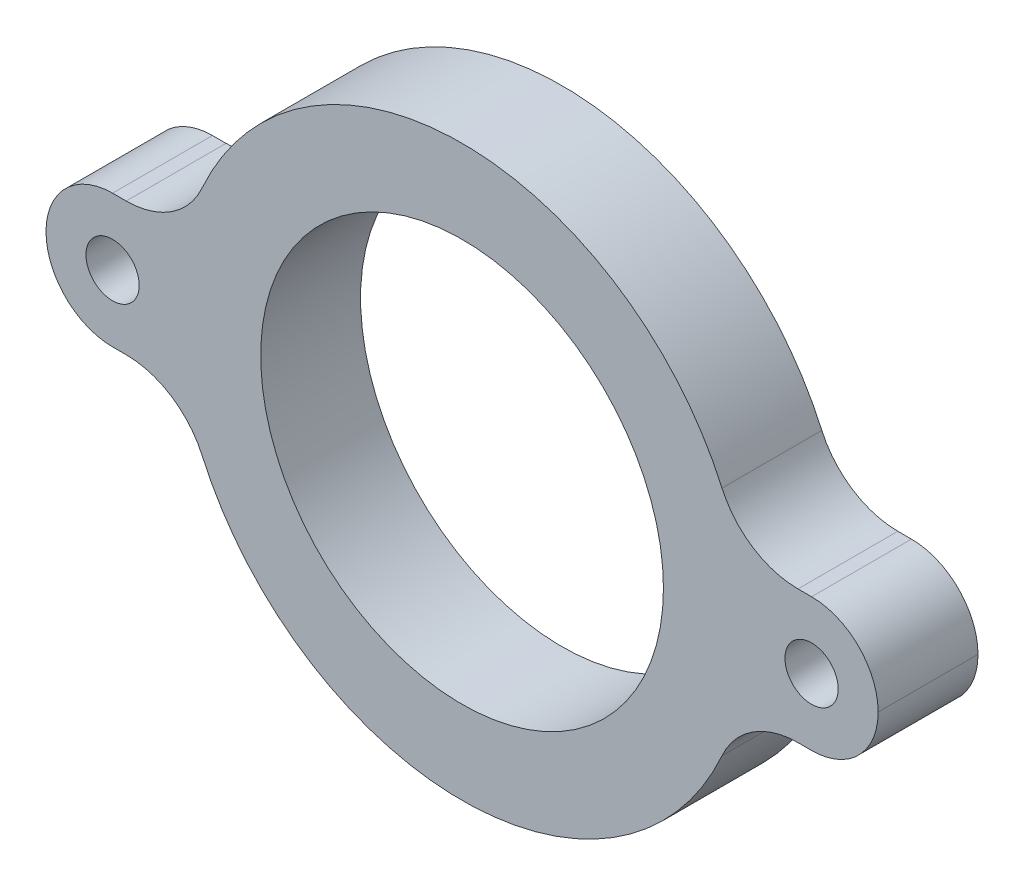
ISO-10303-21;
HEADER;
FILE_DESCRIPTION(('STEP AP214'),'2;1');
FILE_NAME('part.step','',(''),(''),'','','');
FILE_SCHEMA(('AUTOMOTIVE_DESIGN { 1 0 10303 214 1 1 1 1 }'));
ENDSEC;
DATA;
#1=APPLICATION_CONTEXT('core data for automotive mechanical design processes');
#2=APPLICATION_PROTOCOL_DEFINITION('international standard','automotive_design',2000,#1);
#3=PRODUCT_CONTEXT('',#1,'mechanical');
#4=PRODUCT('Part','Part','',(#3));
#5=PRODUCT_RELATED_PRODUCT_CATEGORY('part','',(#4));
#6=PRODUCT_DEFINITION_FORMATION('','',#4);
#7=PRODUCT_DEFINITION_CONTEXT('part definition',#1,'design');
#8=PRODUCT_DEFINITION('design','',#6,#7);
#9=PRODUCT_DEFINITION_SHAPE('','',#8);
#10=(LENGTH_UNIT() NAMED_UNIT(*) SI_UNIT(.MILLI.,.METRE.));
#11=(NAMED_UNIT(*) PLANE_ANGLE_UNIT() SI_UNIT($,.RADIAN.));
#12=(NAMED_UNIT(*) SI_UNIT($,.STERADIAN.) SOLID_ANGLE_UNIT());
#13=UNCERTAINTY_MEASURE_WITH_UNIT(LENGTH_MEASURE(1.E-05),#10,'distance_accuracy_value','');
#14=(GEOMETRIC_REPRESENTATION_CONTEXT(3) GLOBAL_UNCERTAINTY_ASSIGNED_CONTEXT((#13)) GLOBAL_UNIT_ASSIGNED_CONTEXT((#10,
#11,#12)) REPRESENTATION_CONTEXT('',''));
#15=CARTESIAN_POINT('',(0.,0.,0.));
#16=DIRECTION('',(0.,0.,1.));
#17=DIRECTION('',(1.,0.,0.));
#18=AXIS2_PLACEMENT_3D('',#15,#16,#17);
#19=CARTESIAN_POINT('',(0.,0.,6.));
#20=DIRECTION('',(0.,0.,-1.));
#21=DIRECTION('',(-1.,0.,0.));
#22=AXIS2_PLACEMENT_3D('',#19,#20,#21);
#23=PLANE('',#22);
#24=DIRECTION('',(1.,0.,0.));
#25=VECTOR('',#24,1.);
#26=CARTESIAN_POINT('',(25.,-4.,6.));
#27=LINE('',#26,#25);
#28=CARTESIAN_POINT('',(20.1843999167674,-4.,6.));
#29=VERTEX_POINT('',#28);
#30=CARTESIAN_POINT('',(21.,-4.,6.));
#31=VERTEX_POINT('',#30);
#32=EDGE_CURVE('E252',#29,#31,#27,.T.);
#33=ORIENTED_EDGE('',*,*,#32,.T.);
#34=CARTESIAN_POINT('',(21.,0.,6.));
#35=DIRECTION('',(0.,0.,-1.));
#36=DIRECTION('',(-1.,0.,0.));
#37=AXIS2_PLACEMENT_3D('',#34,#35,#36);
#38=CIRCLE('',#37,4.);
#39=CARTESIAN_POINT('',(25.,0.,6.));
#40=VERTEX_POINT('',#39);
#41=EDGE_CURVE('E218',#31,#40,#38,.F.);
#42=ORIENTED_EDGE('',*,*,#41,.T.);
#43=CARTESIAN_POINT('',(21.,0.,6.));
#44=DIRECTION('',(0.,0.,-1.));
#45=DIRECTION('',(-1.,0.,0.));
#46=AXIS2_PLACEMENT_3D('',#43,#44,#45);
#47=CIRCLE('',#46,4.);
#48=CARTESIAN_POINT('',(21.,4.,6.));
#49=VERTEX_POINT('',#48);
#50=EDGE_CURVE('E56',#40,#49,#47,.F.);
#51=ORIENTED_EDGE('',*,*,#50,.T.);
#52=DIRECTION('',(-1.,0.,0.));
#53=VECTOR('',#52,1.);
#54=CARTESIAN_POINT('',(25.,4.,6.));
#55=LINE('',#54,#53);
#56=CARTESIAN_POINT('',(20.1843999167674,4.,6.));
#57=VERTEX_POINT('',#56);
#58=EDGE_CURVE('E249',#49,#57,#55,.T.);
#59=ORIENTED_EDGE('',*,*,#58,.T.);
#60=CARTESIAN_POINT('',(20.1843999167674,9.,6.));
#61=DIRECTION('',(0.,0.,-1.));
#62=DIRECTION('',(-1.,0.,0.));
#63=AXIS2_PLACEMENT_3D('',#60,#61,#62);
#64=CIRCLE('',#63,5.);
#65=CARTESIAN_POINT('',(15.6177936007567,6.96380090497737,6.));
#66=VERTEX_POINT('',#65);
#67=EDGE_CURVE('E147',#57,#66,#64,.T.);
#68=ORIENTED_EDGE('',*,*,#67,.T.);
#69=CARTESIAN_POINT('',(0.,0.,6.));
#70=DIRECTION('',(0.,0.,1.));
#71=DIRECTION('',(-1.,0.,0.));
#72=AXIS2_PLACEMENT_3D('',#69,#70,#71);
#73=CIRCLE('',#72,17.1);
#74=CARTESIAN_POINT('',(-15.6177936007567,6.96380090497737,6.));
#75=VERTEX_POINT('',#74);
#76=EDGE_CURVE('E157',#66,#75,#73,.T.);
#77=ORIENTED_EDGE('',*,*,#76,.T.);
#78=CARTESIAN_POINT('',(-20.1843999167674,9.,6.));
#79=DIRECTION('',(0.,0.,-1.));
#80=DIRECTION('',(-1.,0.,0.));
#81=AXIS2_PLACEMENT_3D('',#78,#79,#80);
#82=CIRCLE('',#81,5.);
#83=CARTESIAN_POINT('',(-20.1843999167674,4.,6.));
#84=VERTEX_POINT('',#83);
#85=EDGE_CURVE('E200',#75,#84,#82,.T.);
#86=ORIENTED_EDGE('',*,*,#85,.T.);
#87=DIRECTION('',(-1.,0.,0.));
#88=VECTOR('',#87,1.);
#89=CARTESIAN_POINT('',(-25.,4.,6.));
#90=LINE('',#89,#88);
#91=CARTESIAN_POINT('',(-21.,4.,6.));
#92=VERTEX_POINT('',#91);
#93=EDGE_CURVE('E173',#84,#92,#90,.T.);
#94=ORIENTED_EDGE('',*,*,#93,.T.);
#95=CARTESIAN_POINT('',(-21.,0.,6.));
#96=DIRECTION('',(0.,0.,-1.));
#97=DIRECTION('',(-1.,0.,0.));
#98=AXIS2_PLACEMENT_3D('',#95,#96,#97);
#99=CIRCLE('',#98,4.);
#100=CARTESIAN_POINT('',(-25.,0.,6.));
#101=VERTEX_POINT('',#100);
#102=EDGE_CURVE('E213',#92,#101,#99,.F.);
#103=ORIENTED_EDGE('',*,*,#102,.T.);
#104=CARTESIAN_POINT('',(-21.,0.,6.));
#105=DIRECTION('',(0.,0.,-1.));
#106=DIRECTION('',(-1.,0.,0.));
#107=AXIS2_PLACEMENT_3D('',#104,#105,#106);
#108=CIRCLE('',#107,4.);
#109=CARTESIAN_POINT('',(-21.,-4.,6.));
#110=VERTEX_POINT('',#109);
#111=EDGE_CURVE('E215',#101,#110,#108,.F.);
#112=ORIENTED_EDGE('',*,*,#111,.T.);
#113=DIRECTION('',(1.,0.,0.));
#114=VECTOR('',#113,1.);
#115=CARTESIAN_POINT('',(-25.,-4.,6.));
#116=LINE('',#115,#114);
#117=CARTESIAN_POINT('',(-20.1843999167674,-4.,6.));
#118=VERTEX_POINT('',#117);
#119=EDGE_CURVE('E167',#110,#118,#116,.T.);
#120=ORIENTED_EDGE('',*,*,#119,.T.);
#121=CARTESIAN_POINT('',(-20.1843999167674,-9.,6.));
#122=DIRECTION('',(0.,0.,-1.));
#123=DIRECTION('',(-1.,0.,0.));
#124=AXIS2_PLACEMENT_3D('',#121,#122,#123);
#125=CIRCLE('',#124,5.);
#126=CARTESIAN_POINT('',(-15.6177936007567,-6.96380090497737,6.));
#127=VERTEX_POINT('',#126);
#128=EDGE_CURVE('E197',#118,#127,#125,.T.);
#129=ORIENTED_EDGE('',*,*,#128,.T.);
#130=CARTESIAN_POINT('',(0.,0.,6.));
#131=DIRECTION('',(0.,0.,1.));
#132=DIRECTION('',(1.,0.,0.));
#133=AXIS2_PLACEMENT_3D('',#130,#131,#132);
#134=CIRCLE('',#133,17.1);
#135=CARTESIAN_POINT('',(15.6177936007567,-6.96380090497737,6.));
#136=VERTEX_POINT('',#135);
#137=EDGE_CURVE('E322',#127,#136,#134,.T.);
#138=ORIENTED_EDGE('',*,*,#137,.T.);
#139=CARTESIAN_POINT('',(20.1843999167674,-9.,6.));
#140=DIRECTION('',(0.,0.,-1.));
#141=DIRECTION('',(-1.,0.,0.));
#142=AXIS2_PLACEMENT_3D('',#139,#140,#141);
#143=CIRCLE('',#142,5.);
#144=EDGE_CURVE('E192',#136,#29,#143,.T.);
#145=ORIENTED_EDGE('',*,*,#144,.T.);
#146=EDGE_LOOP('',(#33,#42,#51,#59,#68,#77,#86,#94,#103,#112,#120,#129,#138,#145));
#147=FACE_BOUND('',#146,.T.);
#148=CARTESIAN_POINT('',(0.,0.,6.));
#149=DIRECTION('',(0.,0.,1.));
#150=DIRECTION('',(1.,0.,0.));
#151=AXIS2_PLACEMENT_3D('',#148,#149,#150);
#152=CIRCLE('',#151,12.1);
#153=CARTESIAN_POINT('',(12.1,0.,6.));
#154=VERTEX_POINT('',#153);
#155=EDGE_CURVE('E259',#154,#154,#152,.T.);
#156=ORIENTED_EDGE('',*,*,#155,.F.);
#157=EDGE_LOOP('',(#156));
#158=FACE_BOUND('',#157,.T.);
#159=CARTESIAN_POINT('',(-21.,0.,6.));
#160=DIRECTION('',(0.,0.,1.));
#161=DIRECTION('',(1.,0.,0.));
#162=AXIS2_PLACEMENT_3D('',#159,#160,#161);
#163=CIRCLE('',#162,1.6);
#164=CARTESIAN_POINT('',(-19.4,0.,6.));
#165=VERTEX_POINT('',#164);
#166=EDGE_CURVE('E313',#165,#165,#163,.T.);
#167=ORIENTED_EDGE('',*,*,#166,.F.);
#168=EDGE_LOOP('',(#167));
#169=FACE_BOUND('',#168,.T.);
#170=CARTESIAN_POINT('',(21.,0.,6.));
#171=DIRECTION('',(0.,0.,1.));
#172=DIRECTION('',(1.,0.,0.));
#173=AXIS2_PLACEMENT_3D('',#170,#171,#172);
#174=CIRCLE('',#173,1.6);
#175=CARTESIAN_POINT('',(22.6,0.,6.));
#176=VERTEX_POINT('',#175);
#177=EDGE_CURVE('E230',#176,#176,#174,.T.);
#178=ORIENTED_EDGE('',*,*,#177,.F.);
#179=EDGE_LOOP('',(#178));
#180=FACE_BOUND('',#179,.T.);
#181=ADVANCED_FACE('F33',(#147,#158,#169,#180),#23,.F.);
#182=CARTESIAN_POINT('',(0.,0.,0.));
#183=DIRECTION('',(0.,0.,-1.));
#184=DIRECTION('',(-1.,0.,0.));
#185=AXIS2_PLACEMENT_3D('',#182,#183,#184);
#186=PLANE('',#185);
#187=CARTESIAN_POINT('',(-21.,0.,0.));
#188=DIRECTION('',(0.,0.,1.));
#189=DIRECTION('',(1.,0.,0.));
#190=AXIS2_PLACEMENT_3D('',#187,#188,#189);
#191=CIRCLE('',#190,1.6);
#192=CARTESIAN_POINT('',(-19.4,0.,0.));
#193=VERTEX_POINT('',#192);
#194=EDGE_CURVE('E317',#193,#193,#191,.T.);
#195=ORIENTED_EDGE('',*,*,#194,.T.);
#196=EDGE_LOOP('',(#195));
#197=FACE_BOUND('',#196,.T.);
#198=CARTESIAN_POINT('',(21.,0.,0.));
#199=DIRECTION('',(0.,0.,-1.));
#200=DIRECTION('',(-1.,0.,0.));
#201=AXIS2_PLACEMENT_3D('',#198,#199,#200);
#202=CIRCLE('',#201,4.);
#203=CARTESIAN_POINT('',(21.,4.,0.));
#204=VERTEX_POINT('',#203);
#205=CARTESIAN_POINT('',(25.,0.,0.));
#206=VERTEX_POINT('',#205);
#207=EDGE_CURVE('E206',#204,#206,#202,.T.);
#208=ORIENTED_EDGE('',*,*,#207,.T.);
#209=CARTESIAN_POINT('',(21.,0.,0.));
#210=DIRECTION('',(0.,0.,-1.));
#211=DIRECTION('',(-1.,0.,0.));
#212=AXIS2_PLACEMENT_3D('',#209,#210,#211);
#213=CIRCLE('',#212,4.);
#214=CARTESIAN_POINT('',(21.,-4.,0.));
#215=VERTEX_POINT('',#214);
#216=EDGE_CURVE('E208',#206,#215,#213,.T.);
#217=ORIENTED_EDGE('',*,*,#216,.T.);
#218=DIRECTION('',(1.,0.,0.));
#219=VECTOR('',#218,1.);
#220=CARTESIAN_POINT('',(25.,-4.,0.));
#221=LINE('',#220,#219);
#222=CARTESIAN_POINT('',(20.1843999167674,-4.,0.));
#223=VERTEX_POINT('',#222);
#224=EDGE_CURVE('E169',#223,#215,#221,.T.);
#225=ORIENTED_EDGE('',*,*,#224,.F.);
#226=CARTESIAN_POINT('',(20.1843999167674,-9.,0.));
#227=DIRECTION('',(0.,0.,-1.));
#228=DIRECTION('',(-1.,0.,0.));
#229=AXIS2_PLACEMENT_3D('',#226,#227,#228);
#230=CIRCLE('',#229,5.);
#231=CARTESIAN_POINT('',(15.6177936007567,-6.96380090497737,0.));
#232=VERTEX_POINT('',#231);
#233=EDGE_CURVE('E190',#223,#232,#230,.F.);
#234=ORIENTED_EDGE('',*,*,#233,.T.);
#235=CARTESIAN_POINT('',(0.,0.,0.));
#236=DIRECTION('',(0.,0.,1.));
#237=DIRECTION('',(1.,0.,0.));
#238=AXIS2_PLACEMENT_3D('',#235,#236,#237);
#239=CIRCLE('',#238,17.1);
#240=CARTESIAN_POINT('',(-15.6177936007567,-6.96380090497737,0.));
#241=VERTEX_POINT('',#240);
#242=EDGE_CURVE('E258',#241,#232,#239,.T.);
#243=ORIENTED_EDGE('',*,*,#242,.F.);
#244=CARTESIAN_POINT('',(-20.1843999167674,-9.,0.));
#245=DIRECTION('',(0.,0.,-1.));
#246=DIRECTION('',(-1.,0.,0.));
#247=AXIS2_PLACEMENT_3D('',#244,#245,#246);
#248=CIRCLE('',#247,5.);
#249=CARTESIAN_POINT('',(-20.1843999167674,-4.,0.));
#250=VERTEX_POINT('',#249);
#251=EDGE_CURVE('E194',#241,#250,#248,.F.);
#252=ORIENTED_EDGE('',*,*,#251,.T.);
#253=DIRECTION('',(1.,0.,0.));
#254=VECTOR('',#253,1.);
#255=CARTESIAN_POINT('',(-25.,-4.,0.));
#256=LINE('',#255,#254);
#257=CARTESIAN_POINT('',(-21.,-4.,0.));
#258=VERTEX_POINT('',#257);
#259=EDGE_CURVE('E256',#258,#250,#256,.T.);
#260=ORIENTED_EDGE('',*,*,#259,.F.);
#261=CARTESIAN_POINT('',(-21.,0.,0.));
#262=DIRECTION('',(0.,0.,-1.));
#263=DIRECTION('',(-1.,0.,0.));
#264=AXIS2_PLACEMENT_3D('',#261,#262,#263);
#265=CIRCLE('',#264,4.);
#266=CARTESIAN_POINT('',(-25.,0.,0.));
#267=VERTEX_POINT('',#266);
#268=EDGE_CURVE('E204',#258,#267,#265,.T.);
#269=ORIENTED_EDGE('',*,*,#268,.T.);
#270=CARTESIAN_POINT('',(-21.,0.,0.));
#271=DIRECTION('',(0.,0.,-1.));
#272=DIRECTION('',(-1.,0.,0.));
#273=AXIS2_PLACEMENT_3D('',#270,#271,#272);
#274=CIRCLE('',#273,4.);
#275=CARTESIAN_POINT('',(-21.,4.,0.));
#276=VERTEX_POINT('',#275);
#277=EDGE_CURVE('E202',#267,#276,#274,.T.);
#278=ORIENTED_EDGE('',*,*,#277,.T.);
#279=DIRECTION('',(-1.,0.,0.));
#280=VECTOR('',#279,1.);
#281=CARTESIAN_POINT('',(-25.,4.,0.));
#282=LINE('',#281,#280);
#283=CARTESIAN_POINT('',(-20.1843999167674,4.,0.));
#284=VERTEX_POINT('',#283);
#285=EDGE_CURVE('E164',#284,#276,#282,.T.);
#286=ORIENTED_EDGE('',*,*,#285,.F.);
#287=CARTESIAN_POINT('',(-20.1843999167674,9.,0.));
#288=DIRECTION('',(0.,0.,-1.));
#289=DIRECTION('',(-1.,0.,0.));
#290=AXIS2_PLACEMENT_3D('',#287,#288,#289);
#291=CIRCLE('',#290,5.);
#292=CARTESIAN_POINT('',(-15.6177936007567,6.96380090497737,0.));
#293=VERTEX_POINT('',#292);
#294=EDGE_CURVE('E163',#284,#293,#291,.F.);
#295=ORIENTED_EDGE('',*,*,#294,.T.);
#296=CARTESIAN_POINT('',(0.,0.,0.));
#297=DIRECTION('',(0.,0.,1.));
#298=DIRECTION('',(-1.,0.,0.));
#299=AXIS2_PLACEMENT_3D('',#296,#297,#298);
#300=CIRCLE('',#299,17.1);
#301=CARTESIAN_POINT('',(15.6177936007567,6.96380090497737,0.));
#302=VERTEX_POINT('',#301);
#303=EDGE_CURVE('E154',#302,#293,#300,.T.);
#304=ORIENTED_EDGE('',*,*,#303,.F.);
#305=CARTESIAN_POINT('',(20.1843999167674,9.,0.));
#306=DIRECTION('',(0.,0.,-1.));
#307=DIRECTION('',(-1.,0.,0.));
#308=AXIS2_PLACEMENT_3D('',#305,#306,#307);
#309=CIRCLE('',#308,5.);
#310=CARTESIAN_POINT('',(20.1843999167674,4.,0.));
#311=VERTEX_POINT('',#310);
#312=EDGE_CURVE('E137',#302,#311,#309,.F.);
#313=ORIENTED_EDGE('',*,*,#312,.T.);
#314=DIRECTION('',(-1.,0.,0.));
#315=VECTOR('',#314,1.);
#316=CARTESIAN_POINT('',(25.,4.,0.));
#317=LINE('',#316,#315);
#318=EDGE_CURVE('E165',#204,#311,#317,.T.);
#319=ORIENTED_EDGE('',*,*,#318,.F.);
#320=EDGE_LOOP('',(#208,#217,#225,#234,#243,#252,#260,#269,#278,#286,#295,#304,#313,#319));
#321=FACE_BOUND('',#320,.T.);
#322=CARTESIAN_POINT('',(0.,0.,0.));
#323=DIRECTION('',(0.,0.,1.));
#324=DIRECTION('',(1.,0.,0.));
#325=AXIS2_PLACEMENT_3D('',#322,#323,#324);
#326=CIRCLE('',#325,12.1);
#327=CARTESIAN_POINT('',(12.1,0.,0.));
#328=VERTEX_POINT('',#327);
#329=EDGE_CURVE('E312',#328,#328,#326,.T.);
#330=ORIENTED_EDGE('',*,*,#329,.T.);
#331=EDGE_LOOP('',(#330));
#332=FACE_BOUND('',#331,.T.);
#333=CARTESIAN_POINT('',(21.,0.,0.));
#334=DIRECTION('',(0.,0.,1.));
#335=DIRECTION('',(1.,0.,0.));
#336=AXIS2_PLACEMENT_3D('',#333,#334,#335);
#337=CIRCLE('',#336,1.6);
#338=CARTESIAN_POINT('',(22.6,0.,0.));
#339=VERTEX_POINT('',#338);
#340=EDGE_CURVE('E225',#339,#339,#337,.T.);
#341=ORIENTED_EDGE('',*,*,#340,.T.);
#342=EDGE_LOOP('',(#341));
#343=FACE_BOUND('',#342,.T.);
#344=ADVANCED_FACE('F160',(#197,#321,#332,#343),#186,.T.);
#345=CARTESIAN_POINT('',(-25.,-4.,6.));
#346=DIRECTION('',(0.,1.,0.));
#347=DIRECTION('',(0.,0.,1.));
#348=AXIS2_PLACEMENT_3D('',#345,#346,#347);
#349=PLANE('',#348);
#350=ORIENTED_EDGE('',*,*,#119,.F.);
#351=DIRECTION('',(0.,0.,-1.));
#352=VECTOR('',#351,1.);
#353=CARTESIAN_POINT('',(-21.,-4.,6.));
#354=LINE('',#353,#352);
#355=EDGE_CURVE('E42',#110,#258,#354,.T.);
#356=ORIENTED_EDGE('',*,*,#355,.T.);
#357=ORIENTED_EDGE('',*,*,#259,.T.);
#358=DIRECTION('',(0.,0.,1.));
#359=VECTOR('',#358,1.);
#360=CARTESIAN_POINT('',(-20.1843999167674,-4.,6.));
#361=LINE('',#360,#359);
#362=EDGE_CURVE('E184',#250,#118,#361,.T.);
#363=ORIENTED_EDGE('',*,*,#362,.T.);
#364=EDGE_LOOP('',(#350,#356,#357,#363));
#365=FACE_BOUND('',#364,.T.);
#366=ADVANCED_FACE('F289',(#365),#349,.F.);
#367=CARTESIAN_POINT('',(0.,0.,6.));
#368=DIRECTION('',(0.,0.,-1.));
#369=DIRECTION('',(-1.,0.,0.));
#370=AXIS2_PLACEMENT_3D('',#367,#368,#369);
#371=CYLINDRICAL_SURFACE('',#370,17.1);
#372=ORIENTED_EDGE('',*,*,#242,.T.);
#373=DIRECTION('',(0.,0.,-1.));
#374=VECTOR('',#373,1.);
#375=CARTESIAN_POINT('',(15.6177936007567,-6.96380090497738,6.));
#376=LINE('',#375,#374);
#377=EDGE_CURVE('E182',#232,#136,#376,.F.);
#378=ORIENTED_EDGE('',*,*,#377,.T.);
#379=ORIENTED_EDGE('',*,*,#137,.F.);
#380=DIRECTION('',(0.,0.,-1.));
#381=VECTOR('',#380,1.);
#382=CARTESIAN_POINT('',(-15.6177936007567,-6.96380090497738,6.));
#383=LINE('',#382,#381);
#384=EDGE_CURVE('E179',#127,#241,#383,.T.);
#385=ORIENTED_EDGE('',*,*,#384,.T.);
#386=EDGE_LOOP('',(#372,#378,#379,#385));
#387=FACE_BOUND('',#386,.T.);
#388=ADVANCED_FACE('F282',(#387),#371,.T.);
#389=CARTESIAN_POINT('',(25.,-4.,6.));
#390=DIRECTION('',(0.,1.,0.));
#391=DIRECTION('',(0.,0.,1.));
#392=AXIS2_PLACEMENT_3D('',#389,#390,#391);
#393=PLANE('',#392);
#394=ORIENTED_EDGE('',*,*,#224,.T.);
#395=DIRECTION('',(0.,0.,-1.));
#396=VECTOR('',#395,1.);
#397=CARTESIAN_POINT('',(21.,-4.,6.));
#398=LINE('',#397,#396);
#399=EDGE_CURVE('E210',#215,#31,#398,.F.);
#400=ORIENTED_EDGE('',*,*,#399,.T.);
#401=ORIENTED_EDGE('',*,*,#32,.F.);
#402=DIRECTION('',(0.,0.,1.));
#403=VECTOR('',#402,1.);
#404=CARTESIAN_POINT('',(20.1843999167674,-4.,0.));
#405=LINE('',#404,#403);
#406=EDGE_CURVE('E176',#29,#223,#405,.F.);
#407=ORIENTED_EDGE('',*,*,#406,.T.);
#408=EDGE_LOOP('',(#394,#400,#401,#407));
#409=FACE_BOUND('',#408,.T.);
#410=ADVANCED_FACE('F265',(#409),#393,.F.);
#411=CARTESIAN_POINT('',(25.,4.,6.));
#412=DIRECTION('',(0.,-1.,0.));
#413=DIRECTION('',(0.,0.,-1.));
#414=AXIS2_PLACEMENT_3D('',#411,#412,#413);
#415=PLANE('',#414);
#416=ORIENTED_EDGE('',*,*,#58,.F.);
#417=DIRECTION('',(0.,0.,-1.));
#418=VECTOR('',#417,1.);
#419=CARTESIAN_POINT('',(21.,4.,6.));
#420=LINE('',#419,#418);
#421=EDGE_CURVE('E220',#49,#204,#420,.T.);
#422=ORIENTED_EDGE('',*,*,#421,.T.);
#423=ORIENTED_EDGE('',*,*,#318,.T.);
#424=DIRECTION('',(0.,0.,1.));
#425=VECTOR('',#424,1.);
#426=CARTESIAN_POINT('',(20.1843999167674,4.,6.));
#427=LINE('',#426,#425);
#428=EDGE_CURVE('E143',#311,#57,#427,.T.);
#429=ORIENTED_EDGE('',*,*,#428,.T.);
#430=EDGE_LOOP('',(#416,#422,#423,#429));
#431=FACE_BOUND('',#430,.T.);
#432=ADVANCED_FACE('F274',(#431),#415,.F.);
#433=CARTESIAN_POINT('',(0.,0.,6.));
#434=DIRECTION('',(0.,0.,-1.));
#435=DIRECTION('',(-1.,0.,0.));
#436=AXIS2_PLACEMENT_3D('',#433,#434,#435);
#437=CYLINDRICAL_SURFACE('',#436,17.1);
#438=ORIENTED_EDGE('',*,*,#76,.F.);
#439=DIRECTION('',(0.,0.,-1.));
#440=VECTOR('',#439,1.);
#441=CARTESIAN_POINT('',(15.6177936007567,6.96380090497738,6.));
#442=LINE('',#441,#440);
#443=EDGE_CURVE('E141',#66,#302,#442,.T.);
#444=ORIENTED_EDGE('',*,*,#443,.T.);
#445=ORIENTED_EDGE('',*,*,#303,.T.);
#446=DIRECTION('',(0.,0.,-1.));
#447=VECTOR('',#446,1.);
#448=CARTESIAN_POINT('',(-15.6177936007567,6.96380090497738,6.));
#449=LINE('',#448,#447);
#450=EDGE_CURVE('E158',#293,#75,#449,.F.);
#451=ORIENTED_EDGE('',*,*,#450,.T.);
#452=EDGE_LOOP('',(#438,#444,#445,#451));
#453=FACE_BOUND('',#452,.T.);
#454=ADVANCED_FACE('F153',(#453),#437,.T.);
#455=CARTESIAN_POINT('',(-25.,4.,6.));
#456=DIRECTION('',(0.,-1.,0.));
#457=DIRECTION('',(0.,0.,-1.));
#458=AXIS2_PLACEMENT_3D('',#455,#456,#457);
#459=PLANE('',#458);
#460=ORIENTED_EDGE('',*,*,#285,.T.);
#461=DIRECTION('',(0.,0.,-1.));
#462=VECTOR('',#461,1.);
#463=CARTESIAN_POINT('',(-21.,4.,6.));
#464=LINE('',#463,#462);
#465=EDGE_CURVE('E11',#276,#92,#464,.F.);
#466=ORIENTED_EDGE('',*,*,#465,.T.);
#467=ORIENTED_EDGE('',*,*,#93,.F.);
#468=DIRECTION('',(0.,0.,1.));
#469=VECTOR('',#468,1.);
#470=CARTESIAN_POINT('',(-20.1843999167674,4.,0.));
#471=LINE('',#470,#469);
#472=EDGE_CURVE('E148',#84,#284,#471,.F.);
#473=ORIENTED_EDGE('',*,*,#472,.T.);
#474=EDGE_LOOP('',(#460,#466,#467,#473));
#475=FACE_BOUND('',#474,.T.);
#476=ADVANCED_FACE('F242',(#475),#459,.F.);
#477=CARTESIAN_POINT('',(0.,0.,6.));
#478=DIRECTION('',(0.,0.,-1.));
#479=DIRECTION('',(-1.,0.,0.));
#480=AXIS2_PLACEMENT_3D('',#477,#478,#479);
#481=CYLINDRICAL_SURFACE('',#480,12.1);
#482=ORIENTED_EDGE('',*,*,#155,.T.);
#483=EDGE_LOOP('',(#482));
#484=FACE_BOUND('',#483,.T.);
#485=ORIENTED_EDGE('',*,*,#329,.F.);
#486=EDGE_LOOP('',(#485));
#487=FACE_BOUND('',#486,.T.);
#488=ADVANCED_FACE('F293',(#484,#487),#481,.F.);
#489=CARTESIAN_POINT('',(-21.,0.,6.));
#490=DIRECTION('',(0.,0.,-1.));
#491=DIRECTION('',(-1.,0.,0.));
#492=AXIS2_PLACEMENT_3D('',#489,#490,#491);
#493=CYLINDRICAL_SURFACE('',#492,1.6);
#494=ORIENTED_EDGE('',*,*,#166,.T.);
#495=EDGE_LOOP('',(#494));
#496=FACE_BOUND('',#495,.T.);
#497=ORIENTED_EDGE('',*,*,#194,.F.);
#498=EDGE_LOOP('',(#497));
#499=FACE_BOUND('',#498,.T.);
#500=ADVANCED_FACE('F300',(#496,#499),#493,.F.);
#501=CARTESIAN_POINT('',(21.,0.,6.));
#502=DIRECTION('',(0.,0.,-1.));
#503=DIRECTION('',(-1.,0.,0.));
#504=AXIS2_PLACEMENT_3D('',#501,#502,#503);
#505=CYLINDRICAL_SURFACE('',#504,1.6);
#506=ORIENTED_EDGE('',*,*,#177,.T.);
#507=EDGE_LOOP('',(#506));
#508=FACE_BOUND('',#507,.T.);
#509=ORIENTED_EDGE('',*,*,#340,.F.);
#510=EDGE_LOOP('',(#509));
#511=FACE_BOUND('',#510,.T.);
#512=ADVANCED_FACE('F305',(#508,#511),#505,.F.);
#513=CARTESIAN_POINT('',(20.1843999167674,9.,6.));
#514=DIRECTION('',(0.,0.,-1.));
#515=DIRECTION('',(-1.,0.,0.));
#516=AXIS2_PLACEMENT_3D('',#513,#514,#515);
#517=CYLINDRICAL_SURFACE('',#516,5.);
#518=ORIENTED_EDGE('',*,*,#67,.F.);
#519=ORIENTED_EDGE('',*,*,#428,.F.);
#520=ORIENTED_EDGE('',*,*,#312,.F.);
#521=ORIENTED_EDGE('',*,*,#443,.F.);
#522=EDGE_LOOP('',(#518,#519,#520,#521));
#523=FACE_BOUND('',#522,.T.);
#524=ADVANCED_FACE('F140',(#523),#517,.F.);
#525=CARTESIAN_POINT('',(20.1843999167674,-9.,6.));
#526=DIRECTION('',(0.,0.,-1.));
#527=DIRECTION('',(-1.,0.,0.));
#528=AXIS2_PLACEMENT_3D('',#525,#526,#527);
#529=CYLINDRICAL_SURFACE('',#528,5.);
#530=ORIENTED_EDGE('',*,*,#144,.F.);
#531=ORIENTED_EDGE('',*,*,#377,.F.);
#532=ORIENTED_EDGE('',*,*,#233,.F.);
#533=ORIENTED_EDGE('',*,*,#406,.F.);
#534=EDGE_LOOP('',(#530,#531,#532,#533));
#535=FACE_BOUND('',#534,.T.);
#536=ADVANCED_FACE('F331',(#535),#529,.F.);
#537=CARTESIAN_POINT('',(-20.1843999167674,-9.,6.));
#538=DIRECTION('',(0.,0.,-1.));
#539=DIRECTION('',(-1.,0.,0.));
#540=AXIS2_PLACEMENT_3D('',#537,#538,#539);
#541=CYLINDRICAL_SURFACE('',#540,5.);
#542=ORIENTED_EDGE('',*,*,#128,.F.);
#543=ORIENTED_EDGE('',*,*,#362,.F.);
#544=ORIENTED_EDGE('',*,*,#251,.F.);
#545=ORIENTED_EDGE('',*,*,#384,.F.);
#546=EDGE_LOOP('',(#542,#543,#544,#545));
#547=FACE_BOUND('',#546,.T.);
#548=ADVANCED_FACE('F334',(#547),#541,.F.);
#549=CARTESIAN_POINT('',(-20.1843999167674,9.,6.));
#550=DIRECTION('',(0.,0.,-1.));
#551=DIRECTION('',(-1.,0.,0.));
#552=AXIS2_PLACEMENT_3D('',#549,#550,#551);
#553=CYLINDRICAL_SURFACE('',#552,5.);
#554=ORIENTED_EDGE('',*,*,#85,.F.);
#555=ORIENTED_EDGE('',*,*,#450,.F.);
#556=ORIENTED_EDGE('',*,*,#294,.F.);
#557=ORIENTED_EDGE('',*,*,#472,.F.);
#558=EDGE_LOOP('',(#554,#555,#556,#557));
#559=FACE_BOUND('',#558,.T.);
#560=ADVANCED_FACE('F246',(#559),#553,.F.);
#561=CARTESIAN_POINT('',(21.,0.,6.));
#562=DIRECTION('',(0.,0.,-1.));
#563=DIRECTION('',(-1.,0.,0.));
#564=AXIS2_PLACEMENT_3D('',#561,#562,#563);
#565=CYLINDRICAL_SURFACE('',#564,4.);
#566=ORIENTED_EDGE('',*,*,#421,.F.);
#567=ORIENTED_EDGE('',*,*,#50,.F.);
#568=DIRECTION('',(0.,0.,-1.));
#569=VECTOR('',#568,1.);
#570=CARTESIAN_POINT('',(25.,0.,6.));
#571=LINE('',#570,#569);
#572=EDGE_CURVE('E223',#206,#40,#571,.F.);
#573=ORIENTED_EDGE('',*,*,#572,.F.);
#574=ORIENTED_EDGE('',*,*,#207,.F.);
#575=EDGE_LOOP('',(#566,#567,#573,#574));
#576=FACE_BOUND('',#575,.T.);
#577=ADVANCED_FACE('F271',(#576),#565,.T.);
#578=CARTESIAN_POINT('',(21.,0.,6.));
#579=DIRECTION('',(0.,0.,-1.));
#580=DIRECTION('',(-1.,0.,0.));
#581=AXIS2_PLACEMENT_3D('',#578,#579,#580);
#582=CYLINDRICAL_SURFACE('',#581,4.);
#583=ORIENTED_EDGE('',*,*,#41,.F.);
#584=ORIENTED_EDGE('',*,*,#399,.F.);
#585=ORIENTED_EDGE('',*,*,#216,.F.);
#586=ORIENTED_EDGE('',*,*,#572,.T.);
#587=EDGE_LOOP('',(#583,#584,#585,#586));
#588=FACE_BOUND('',#587,.T.);
#589=ADVANCED_FACE('F268',(#588),#582,.T.);
#590=CARTESIAN_POINT('',(-21.,0.,6.));
#591=DIRECTION('',(0.,0.,-1.));
#592=DIRECTION('',(-1.,0.,0.));
#593=AXIS2_PLACEMENT_3D('',#590,#591,#592);
#594=CYLINDRICAL_SURFACE('',#593,4.);
#595=DIRECTION('',(0.,0.,-1.));
#596=VECTOR('',#595,1.);
#597=CARTESIAN_POINT('',(-25.,0.,6.));
#598=LINE('',#597,#596);
#599=EDGE_CURVE('E37',#101,#267,#598,.T.);
#600=ORIENTED_EDGE('',*,*,#599,.F.);
#601=ORIENTED_EDGE('',*,*,#102,.F.);
#602=ORIENTED_EDGE('',*,*,#465,.F.);
#603=ORIENTED_EDGE('',*,*,#277,.F.);
#604=EDGE_LOOP('',(#600,#601,#602,#603));
#605=FACE_BOUND('',#604,.T.);
#606=ADVANCED_FACE('F35',(#605),#594,.T.);
#607=CARTESIAN_POINT('',(-21.,0.,6.));
#608=DIRECTION('',(0.,0.,-1.));
#609=DIRECTION('',(-1.,0.,0.));
#610=AXIS2_PLACEMENT_3D('',#607,#608,#609);
#611=CYLINDRICAL_SURFACE('',#610,4.);
#612=ORIENTED_EDGE('',*,*,#111,.F.);
#613=ORIENTED_EDGE('',*,*,#599,.T.);
#614=ORIENTED_EDGE('',*,*,#268,.F.);
#615=ORIENTED_EDGE('',*,*,#355,.F.);
#616=EDGE_LOOP('',(#612,#613,#614,#615));
#617=FACE_BOUND('',#616,.T.);
#618=ADVANCED_FACE('F236',(#617),#611,.T.);
#619=CLOSED_SHELL('',(#181,#344,#366,#388,#410,#432,#454,#476,#488,#500,#512,#524,#536,#548,
#560,#577,#589,#606,#618));
#620=MANIFOLD_SOLID_BREP('B2',#619);
#621=ADVANCED_BREP_SHAPE_REPRESENTATION('',(#18,#620),#14);
#622=SHAPE_DEFINITION_REPRESENTATION(#9,#621);
ENDSEC;
END-ISO-10303-21;
